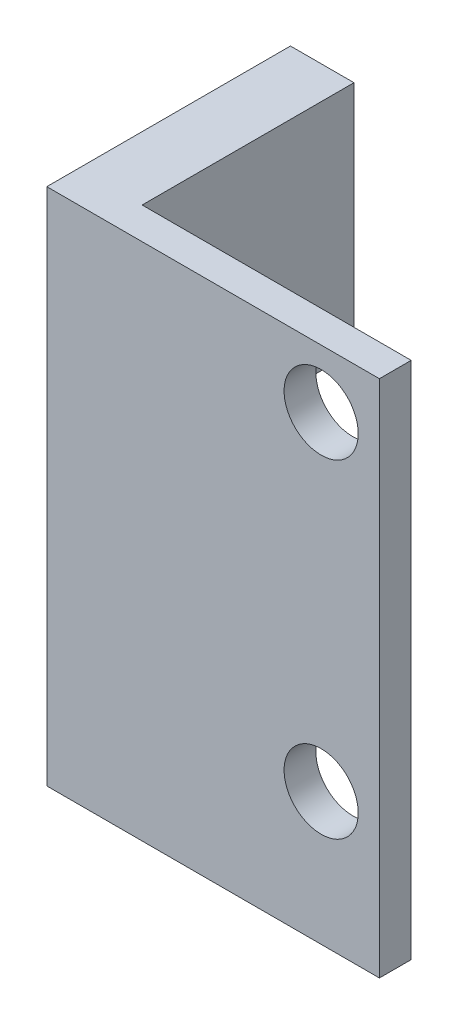
ISO-10303-21;
HEADER;
FILE_DESCRIPTION(('STEP AP214'),'2;1');
FILE_NAME('part.step','',(''),(''),'','','');
FILE_SCHEMA(('AUTOMOTIVE_DESIGN { 1 0 10303 214 1 1 1 1 }'));
ENDSEC;
DATA;
#1=APPLICATION_CONTEXT('core data for automotive mechanical design processes');
#2=APPLICATION_PROTOCOL_DEFINITION('international standard','automotive_design',2000,#1);
#3=PRODUCT_CONTEXT('',#1,'mechanical');
#4=PRODUCT('Part','Part','',(#3));
#5=PRODUCT_RELATED_PRODUCT_CATEGORY('part','',(#4));
#6=PRODUCT_DEFINITION_FORMATION('','',#4);
#7=PRODUCT_DEFINITION_CONTEXT('part definition',#1,'design');
#8=PRODUCT_DEFINITION('design','',#6,#7);
#9=PRODUCT_DEFINITION_SHAPE('','',#8);
#10=(LENGTH_UNIT() NAMED_UNIT(*) SI_UNIT(.MILLI.,.METRE.));
#11=(NAMED_UNIT(*) PLANE_ANGLE_UNIT() SI_UNIT($,.RADIAN.));
#12=(NAMED_UNIT(*) SI_UNIT($,.STERADIAN.) SOLID_ANGLE_UNIT());
#13=UNCERTAINTY_MEASURE_WITH_UNIT(LENGTH_MEASURE(1.E-05),#10,'distance_accuracy_value','');
#14=(GEOMETRIC_REPRESENTATION_CONTEXT(3) GLOBAL_UNCERTAINTY_ASSIGNED_CONTEXT((#13)) GLOBAL_UNIT_ASSIGNED_CONTEXT((#10,
#11,#12)) REPRESENTATION_CONTEXT('',''));
#15=CARTESIAN_POINT('',(0.,0.,0.));
#16=DIRECTION('',(0.,0.,1.));
#17=DIRECTION('',(1.,0.,0.));
#18=AXIS2_PLACEMENT_3D('',#15,#16,#17);
#19=CARTESIAN_POINT('',(0.,0.,0.));
#20=DIRECTION('',(0.,0.,1.));
#21=DIRECTION('',(1.,0.,0.));
#22=AXIS2_PLACEMENT_3D('',#19,#20,#21);
#23=PLANE('',#22);
#24=CARTESIAN_POINT('',(-2.75,6.25,0.));
#25=DIRECTION('',(0.,0.,1.));
#26=DIRECTION('',(1.,0.,0.));
#27=AXIS2_PLACEMENT_3D('',#24,#25,#26);
#28=CIRCLE('',#27,1.75);
#29=CARTESIAN_POINT('',(-1.,6.25,0.));
#30=VERTEX_POINT('',#29);
#31=EDGE_CURVE('E128',#30,#30,#28,.T.);
#32=ORIENTED_EDGE('',*,*,#31,.T.);
#33=EDGE_LOOP('',(#32));
#34=FACE_BOUND('',#33,.T.);
#35=CARTESIAN_POINT('',(-2.75,21.75,0.));
#36=DIRECTION('',(0.,0.,1.));
#37=DIRECTION('',(1.,0.,0.));
#38=AXIS2_PLACEMENT_3D('',#35,#36,#37);
#39=CIRCLE('',#38,1.75);
#40=CARTESIAN_POINT('',(-0.999999999999999,21.75,0.));
#41=VERTEX_POINT('',#40);
#42=EDGE_CURVE('E132',#41,#41,#39,.T.);
#43=ORIENTED_EDGE('',*,*,#42,.T.);
#44=EDGE_LOOP('',(#43));
#45=FACE_BOUND('',#44,.T.);
#46=DIRECTION('',(-1.,0.,0.));
#47=VECTOR('',#46,1.);
#48=CARTESIAN_POINT('',(-15.7,13.5,0.));
#49=LINE('',#48,#47);
#50=CARTESIAN_POINT('',(-12.7,13.5,0.));
#51=VERTEX_POINT('',#50);
#52=CARTESIAN_POINT('',(-15.7,13.5,0.));
#53=VERTEX_POINT('',#52);
#54=EDGE_CURVE('E115',#51,#53,#49,.T.);
#55=ORIENTED_EDGE('',*,*,#54,.F.);
#56=DIRECTION('',(0.,-1.,0.));
#57=VECTOR('',#56,1.);
#58=CARTESIAN_POINT('',(-12.7,24.5,0.));
#59=LINE('',#58,#57);
#60=CARTESIAN_POINT('',(-12.7,24.5,0.));
#61=VERTEX_POINT('',#60);
#62=EDGE_CURVE('E49',#61,#51,#59,.T.);
#63=ORIENTED_EDGE('',*,*,#62,.F.);
#64=DIRECTION('',(-1.,0.,0.));
#65=VECTOR('',#64,1.);
#66=CARTESIAN_POINT('',(0.,24.5,0.));
#67=LINE('',#66,#65);
#68=CARTESIAN_POINT('',(0.,24.5,0.));
#69=VERTEX_POINT('',#68);
#70=EDGE_CURVE('E153',#69,#61,#67,.T.);
#71=ORIENTED_EDGE('',*,*,#70,.F.);
#72=DIRECTION('',(0.,1.,0.));
#73=VECTOR('',#72,1.);
#74=CARTESIAN_POINT('',(0.,0.,0.));
#75=LINE('',#74,#73);
#76=CARTESIAN_POINT('',(0.,0.,0.));
#77=VERTEX_POINT('',#76);
#78=EDGE_CURVE('E138',#77,#69,#75,.T.);
#79=ORIENTED_EDGE('',*,*,#78,.F.);
#80=DIRECTION('',(1.,0.,0.));
#81=VECTOR('',#80,1.);
#82=CARTESIAN_POINT('',(0.,0.,0.));
#83=LINE('',#82,#81);
#84=CARTESIAN_POINT('',(-15.7,0.,0.));
#85=VERTEX_POINT('',#84);
#86=EDGE_CURVE('E145',#85,#77,#83,.T.);
#87=ORIENTED_EDGE('',*,*,#86,.F.);
#88=DIRECTION('',(0.,-1.,0.));
#89=VECTOR('',#88,1.);
#90=CARTESIAN_POINT('',(-15.7,0.,0.));
#91=LINE('',#90,#89);
#92=EDGE_CURVE('E55',#53,#85,#91,.T.);
#93=ORIENTED_EDGE('',*,*,#92,.F.);
#94=EDGE_LOOP('',(#55,#63,#71,#79,#87,#93));
#95=FACE_BOUND('',#94,.T.);
#96=ADVANCED_FACE('F34',(#34,#45,#95),#23,.F.);
#97=CARTESIAN_POINT('',(0.,0.,1.5));
#98=DIRECTION('',(0.,0.,1.));
#99=DIRECTION('',(1.,0.,0.));
#100=AXIS2_PLACEMENT_3D('',#97,#98,#99);
#101=PLANE('',#100);
#102=CARTESIAN_POINT('',(-2.75,21.75,1.5));
#103=DIRECTION('',(0.,0.,1.));
#104=DIRECTION('',(1.,0.,0.));
#105=AXIS2_PLACEMENT_3D('',#102,#103,#104);
#106=CIRCLE('',#105,1.75);
#107=CARTESIAN_POINT('',(-0.999999999999999,21.75,1.5));
#108=VERTEX_POINT('',#107);
#109=EDGE_CURVE('E135',#108,#108,#106,.T.);
#110=ORIENTED_EDGE('',*,*,#109,.F.);
#111=EDGE_LOOP('',(#110));
#112=FACE_BOUND('',#111,.T.);
#113=DIRECTION('',(0.,1.,0.));
#114=VECTOR('',#113,1.);
#115=CARTESIAN_POINT('',(0.,0.,1.5));
#116=LINE('',#115,#114);
#117=CARTESIAN_POINT('',(0.,0.,1.5));
#118=VERTEX_POINT('',#117);
#119=CARTESIAN_POINT('',(0.,24.5,1.5));
#120=VERTEX_POINT('',#119);
#121=EDGE_CURVE('E141',#118,#120,#116,.T.);
#122=ORIENTED_EDGE('',*,*,#121,.T.);
#123=DIRECTION('',(-1.,0.,0.));
#124=VECTOR('',#123,1.);
#125=CARTESIAN_POINT('',(0.,24.5,1.5));
#126=LINE('',#125,#124);
#127=CARTESIAN_POINT('',(-15.7,24.5,1.5));
#128=VERTEX_POINT('',#127);
#129=EDGE_CURVE('E144',#120,#128,#126,.T.);
#130=ORIENTED_EDGE('',*,*,#129,.T.);
#131=DIRECTION('',(0.,-1.,0.));
#132=VECTOR('',#131,1.);
#133=CARTESIAN_POINT('',(-15.7,0.,1.5));
#134=LINE('',#133,#132);
#135=CARTESIAN_POINT('',(-15.7,0.,1.5));
#136=VERTEX_POINT('',#135);
#137=EDGE_CURVE('E99',#128,#136,#134,.T.);
#138=ORIENTED_EDGE('',*,*,#137,.T.);
#139=DIRECTION('',(1.,0.,0.));
#140=VECTOR('',#139,1.);
#141=CARTESIAN_POINT('',(0.,0.,1.5));
#142=LINE('',#141,#140);
#143=EDGE_CURVE('E148',#136,#118,#142,.T.);
#144=ORIENTED_EDGE('',*,*,#143,.T.);
#145=EDGE_LOOP('',(#122,#130,#138,#144));
#146=FACE_BOUND('',#145,.T.);
#147=CARTESIAN_POINT('',(-2.75,6.25,1.5));
#148=DIRECTION('',(0.,0.,1.));
#149=DIRECTION('',(1.,0.,0.));
#150=AXIS2_PLACEMENT_3D('',#147,#148,#149);
#151=CIRCLE('',#150,1.75);
#152=CARTESIAN_POINT('',(-1.,6.25,1.5));
#153=VERTEX_POINT('',#152);
#154=EDGE_CURVE('E129',#153,#153,#151,.T.);
#155=ORIENTED_EDGE('',*,*,#154,.F.);
#156=EDGE_LOOP('',(#155));
#157=FACE_BOUND('',#156,.T.);
#158=ADVANCED_FACE('F169',(#112,#146,#157),#101,.T.);
#159=CARTESIAN_POINT('',(0.,0.,1.5));
#160=DIRECTION('',(-1.,0.,0.));
#161=DIRECTION('',(0.,0.,1.));
#162=AXIS2_PLACEMENT_3D('',#159,#160,#161);
#163=PLANE('',#162);
#164=ORIENTED_EDGE('',*,*,#78,.T.);
#165=DIRECTION('',(0.,0.,-1.));
#166=VECTOR('',#165,1.);
#167=CARTESIAN_POINT('',(0.,24.5,1.5));
#168=LINE('',#167,#166);
#169=EDGE_CURVE('E11',#120,#69,#168,.T.);
#170=ORIENTED_EDGE('',*,*,#169,.F.);
#171=ORIENTED_EDGE('',*,*,#121,.F.);
#172=DIRECTION('',(0.,0.,-1.));
#173=VECTOR('',#172,1.);
#174=CARTESIAN_POINT('',(0.,0.,1.5));
#175=LINE('',#174,#173);
#176=EDGE_CURVE('E150',#118,#77,#175,.T.);
#177=ORIENTED_EDGE('',*,*,#176,.T.);
#178=EDGE_LOOP('',(#164,#170,#171,#177));
#179=FACE_BOUND('',#178,.T.);
#180=ADVANCED_FACE('F36',(#179),#163,.F.);
#181=CARTESIAN_POINT('',(0.,24.5,1.5));
#182=DIRECTION('',(0.,-1.,0.));
#183=DIRECTION('',(1.,0.,0.));
#184=AXIS2_PLACEMENT_3D('',#181,#182,#183);
#185=PLANE('',#184);
#186=ORIENTED_EDGE('',*,*,#70,.T.);
#187=DIRECTION('',(0.,0.,1.));
#188=VECTOR('',#187,1.);
#189=CARTESIAN_POINT('',(-12.7,24.5,-10.));
#190=LINE('',#189,#188);
#191=CARTESIAN_POINT('',(-12.7,24.5,-10.));
#192=VERTEX_POINT('',#191);
#193=EDGE_CURVE('E106',#192,#61,#190,.T.);
#194=ORIENTED_EDGE('',*,*,#193,.F.);
#195=DIRECTION('',(1.,0.,0.));
#196=VECTOR('',#195,1.);
#197=CARTESIAN_POINT('',(-15.7,24.5,-10.));
#198=LINE('',#197,#196);
#199=CARTESIAN_POINT('',(-15.7,24.5,-10.));
#200=VERTEX_POINT('',#199);
#201=EDGE_CURVE('E103',#200,#192,#198,.T.);
#202=ORIENTED_EDGE('',*,*,#201,.F.);
#203=DIRECTION('',(0.,0.,-1.));
#204=VECTOR('',#203,1.);
#205=CARTESIAN_POINT('',(-15.7,24.5,1.5));
#206=LINE('',#205,#204);
#207=EDGE_CURVE('E42',#128,#200,#206,.T.);
#208=ORIENTED_EDGE('',*,*,#207,.F.);
#209=ORIENTED_EDGE('',*,*,#129,.F.);
#210=ORIENTED_EDGE('',*,*,#169,.T.);
#211=EDGE_LOOP('',(#186,#194,#202,#208,#209,#210));
#212=FACE_BOUND('',#211,.T.);
#213=ADVANCED_FACE('F104',(#212),#185,.F.);
#214=CARTESIAN_POINT('',(-15.7,0.,1.5));
#215=DIRECTION('',(1.,0.,0.));
#216=DIRECTION('',(0.,0.,-1.));
#217=AXIS2_PLACEMENT_3D('',#214,#215,#216);
#218=PLANE('',#217);
#219=ORIENTED_EDGE('',*,*,#207,.T.);
#220=DIRECTION('',(0.,1.,0.));
#221=VECTOR('',#220,1.);
#222=CARTESIAN_POINT('',(-15.7,24.5,-10.));
#223=LINE('',#222,#221);
#224=CARTESIAN_POINT('',(-15.7,13.5,-10.));
#225=VERTEX_POINT('',#224);
#226=EDGE_CURVE('E97',#225,#200,#223,.T.);
#227=ORIENTED_EDGE('',*,*,#226,.F.);
#228=DIRECTION('',(0.,0.,1.));
#229=VECTOR('',#228,1.);
#230=CARTESIAN_POINT('',(-15.7,13.5,-10.));
#231=LINE('',#230,#229);
#232=EDGE_CURVE('E121',#225,#53,#231,.T.);
#233=ORIENTED_EDGE('',*,*,#232,.T.);
#234=ORIENTED_EDGE('',*,*,#92,.T.);
#235=DIRECTION('',(0.,0.,-1.));
#236=VECTOR('',#235,1.);
#237=CARTESIAN_POINT('',(-15.7,0.,1.5));
#238=LINE('',#237,#236);
#239=EDGE_CURVE('E101',#136,#85,#238,.T.);
#240=ORIENTED_EDGE('',*,*,#239,.F.);
#241=ORIENTED_EDGE('',*,*,#137,.F.);
#242=EDGE_LOOP('',(#219,#227,#233,#234,#240,#241));
#243=FACE_BOUND('',#242,.T.);
#244=ADVANCED_FACE('F94',(#243),#218,.F.);
#245=CARTESIAN_POINT('',(0.,0.,1.5));
#246=DIRECTION('',(0.,1.,0.));
#247=DIRECTION('',(-1.,0.,0.));
#248=AXIS2_PLACEMENT_3D('',#245,#246,#247);
#249=PLANE('',#248);
#250=ORIENTED_EDGE('',*,*,#86,.T.);
#251=ORIENTED_EDGE('',*,*,#176,.F.);
#252=ORIENTED_EDGE('',*,*,#143,.F.);
#253=ORIENTED_EDGE('',*,*,#239,.T.);
#254=EDGE_LOOP('',(#250,#251,#252,#253));
#255=FACE_BOUND('',#254,.T.);
#256=ADVANCED_FACE('F162',(#255),#249,.F.);
#257=CARTESIAN_POINT('',(-2.75,21.75,1.5));
#258=DIRECTION('',(0.,0.,-1.));
#259=DIRECTION('',(-1.,0.,0.));
#260=AXIS2_PLACEMENT_3D('',#257,#258,#259);
#261=CYLINDRICAL_SURFACE('',#260,1.75);
#262=ORIENTED_EDGE('',*,*,#109,.T.);
#263=EDGE_LOOP('',(#262));
#264=FACE_BOUND('',#263,.T.);
#265=ORIENTED_EDGE('',*,*,#42,.F.);
#266=EDGE_LOOP('',(#265));
#267=FACE_BOUND('',#266,.T.);
#268=ADVANCED_FACE('F198',(#264,#267),#261,.F.);
#269=CARTESIAN_POINT('',(-2.75,6.25,1.5));
#270=DIRECTION('',(0.,0.,-1.));
#271=DIRECTION('',(-1.,0.,0.));
#272=AXIS2_PLACEMENT_3D('',#269,#270,#271);
#273=CYLINDRICAL_SURFACE('',#272,1.75);
#274=ORIENTED_EDGE('',*,*,#154,.T.);
#275=EDGE_LOOP('',(#274));
#276=FACE_BOUND('',#275,.T.);
#277=ORIENTED_EDGE('',*,*,#31,.F.);
#278=EDGE_LOOP('',(#277));
#279=FACE_BOUND('',#278,.T.);
#280=ADVANCED_FACE('F183',(#276,#279),#273,.F.);
#281=CARTESIAN_POINT('',(-12.7,24.5,-10.));
#282=DIRECTION('',(-1.,0.,0.));
#283=DIRECTION('',(0.,0.,1.));
#284=AXIS2_PLACEMENT_3D('',#281,#282,#283);
#285=PLANE('',#284);
#286=ORIENTED_EDGE('',*,*,#62,.T.);
#287=DIRECTION('',(0.,0.,1.));
#288=VECTOR('',#287,1.);
#289=CARTESIAN_POINT('',(-12.7,13.5,-10.));
#290=LINE('',#289,#288);
#291=CARTESIAN_POINT('',(-12.7,13.5,-10.));
#292=VERTEX_POINT('',#291);
#293=EDGE_CURVE('E124',#292,#51,#290,.T.);
#294=ORIENTED_EDGE('',*,*,#293,.F.);
#295=DIRECTION('',(0.,-1.,0.));
#296=VECTOR('',#295,1.);
#297=CARTESIAN_POINT('',(-12.7,24.5,-10.));
#298=LINE('',#297,#296);
#299=EDGE_CURVE('E109',#192,#292,#298,.T.);
#300=ORIENTED_EDGE('',*,*,#299,.F.);
#301=ORIENTED_EDGE('',*,*,#193,.T.);
#302=EDGE_LOOP('',(#286,#294,#300,#301));
#303=FACE_BOUND('',#302,.T.);
#304=ADVANCED_FACE('F172',(#303),#285,.F.);
#305=CARTESIAN_POINT('',(-15.7,13.5,-10.));
#306=DIRECTION('',(0.,1.,0.));
#307=DIRECTION('',(0.,0.,1.));
#308=AXIS2_PLACEMENT_3D('',#305,#306,#307);
#309=PLANE('',#308);
#310=ORIENTED_EDGE('',*,*,#54,.T.);
#311=ORIENTED_EDGE('',*,*,#232,.F.);
#312=DIRECTION('',(-1.,0.,0.));
#313=VECTOR('',#312,1.);
#314=CARTESIAN_POINT('',(-15.7,13.5,-10.));
#315=LINE('',#314,#313);
#316=EDGE_CURVE('E113',#292,#225,#315,.T.);
#317=ORIENTED_EDGE('',*,*,#316,.F.);
#318=ORIENTED_EDGE('',*,*,#293,.T.);
#319=EDGE_LOOP('',(#310,#311,#317,#318));
#320=FACE_BOUND('',#319,.T.);
#321=ADVANCED_FACE('F175',(#320),#309,.F.);
#322=CARTESIAN_POINT('',(0.,0.,-10.));
#323=DIRECTION('',(0.,0.,1.));
#324=DIRECTION('',(1.,0.,0.));
#325=AXIS2_PLACEMENT_3D('',#322,#323,#324);
#326=PLANE('',#325);
#327=ORIENTED_EDGE('',*,*,#226,.T.);
#328=ORIENTED_EDGE('',*,*,#201,.T.);
#329=ORIENTED_EDGE('',*,*,#299,.T.);
#330=ORIENTED_EDGE('',*,*,#316,.T.);
#331=EDGE_LOOP('',(#327,#328,#329,#330));
#332=FACE_BOUND('',#331,.T.);
#333=ADVANCED_FACE('F111',(#332),#326,.F.);
#334=CLOSED_SHELL('',(#96,#158,#180,#213,#244,#256,#268,#280,#304,#321,#333));
#335=MANIFOLD_SOLID_BREP('B2',#334);
#336=ADVANCED_BREP_SHAPE_REPRESENTATION('',(#18,#335),#14);
#337=SHAPE_DEFINITION_REPRESENTATION(#9,#336);
ENDSEC;
END-ISO-10303-21;
